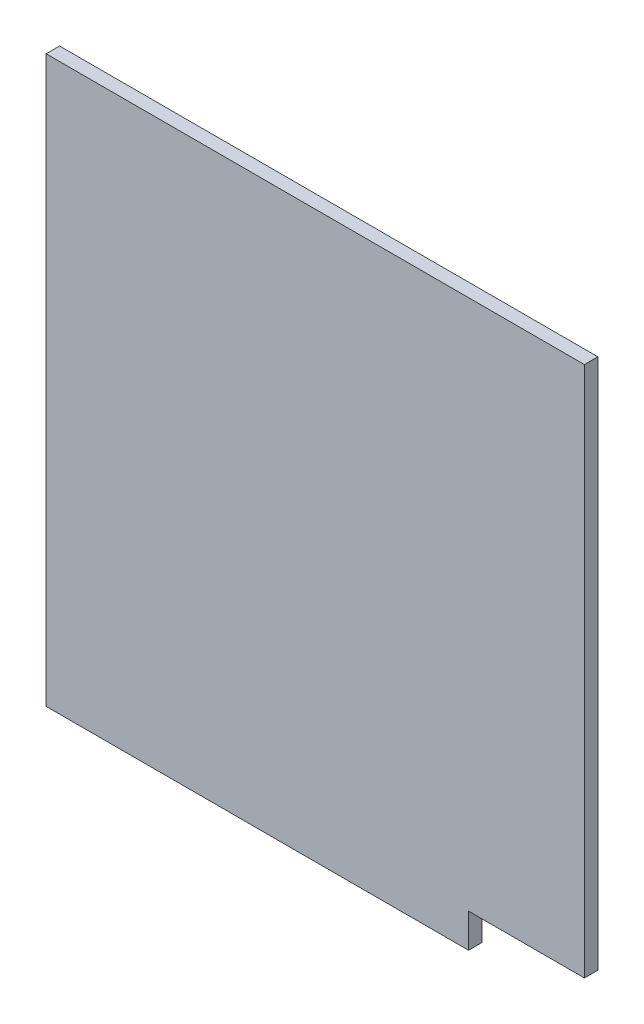
ISO-10303-21;
HEADER;
FILE_DESCRIPTION(('STEP AP214'),'2;1');
FILE_NAME('part.step','',(''),(''),'','','');
FILE_SCHEMA(('AUTOMOTIVE_DESIGN { 1 0 10303 214 1 1 1 1 }'));
ENDSEC;
DATA;
#1=APPLICATION_CONTEXT('core data for automotive mechanical design processes');
#2=APPLICATION_PROTOCOL_DEFINITION('international standard','automotive_design',2000,#1);
#3=PRODUCT_CONTEXT('',#1,'mechanical');
#4=PRODUCT('Part','Part','',(#3));
#5=PRODUCT_RELATED_PRODUCT_CATEGORY('part','',(#4));
#6=PRODUCT_DEFINITION_FORMATION('','',#4);
#7=PRODUCT_DEFINITION_CONTEXT('part definition',#1,'design');
#8=PRODUCT_DEFINITION('design','',#6,#7);
#9=PRODUCT_DEFINITION_SHAPE('','',#8);
#10=(LENGTH_UNIT() NAMED_UNIT(*) SI_UNIT(.MILLI.,.METRE.));
#11=(NAMED_UNIT(*) PLANE_ANGLE_UNIT() SI_UNIT($,.RADIAN.));
#12=(NAMED_UNIT(*) SI_UNIT($,.STERADIAN.) SOLID_ANGLE_UNIT());
#13=UNCERTAINTY_MEASURE_WITH_UNIT(LENGTH_MEASURE(1.E-05),#10,'distance_accuracy_value','');
#14=(GEOMETRIC_REPRESENTATION_CONTEXT(3) GLOBAL_UNCERTAINTY_ASSIGNED_CONTEXT((#13)) GLOBAL_UNIT_ASSIGNED_CONTEXT((#10,
#11,#12)) REPRESENTATION_CONTEXT('',''));
#15=CARTESIAN_POINT('',(0.,0.,0.));
#16=DIRECTION('',(0.,0.,1.));
#17=DIRECTION('',(1.,0.,0.));
#18=AXIS2_PLACEMENT_3D('',#15,#16,#17);
#19=CARTESIAN_POINT('',(0.,-200.,-4.7625));
#20=DIRECTION('',(0.,-1.,0.));
#21=DIRECTION('',(0.,0.,-1.));
#22=AXIS2_PLACEMENT_3D('',#19,#20,#21);
#23=PLANE('',#22);
#24=DIRECTION('',(1.,0.,0.));
#25=VECTOR('',#24,1.);
#26=CARTESIAN_POINT('',(0.,-200.,0.));
#27=LINE('',#26,#25);
#28=CARTESIAN_POINT('',(4.7625,-200.,0.));
#29=VERTEX_POINT('',#28);
#30=CARTESIAN_POINT('',(154.2375,-200.,0.));
#31=VERTEX_POINT('',#30);
#32=EDGE_CURVE('E117',#29,#31,#27,.T.);
#33=ORIENTED_EDGE('',*,*,#32,.F.);
#34=DIRECTION('',(0.,0.,1.));
#35=VECTOR('',#34,1.);
#36=CARTESIAN_POINT('',(4.7625,-200.,-4.7625));
#37=LINE('',#36,#35);
#38=CARTESIAN_POINT('',(4.7625,-200.,-4.7625));
#39=VERTEX_POINT('',#38);
#40=EDGE_CURVE('E11',#39,#29,#37,.T.);
#41=ORIENTED_EDGE('',*,*,#40,.F.);
#42=DIRECTION('',(1.,0.,0.));
#43=VECTOR('',#42,1.);
#44=CARTESIAN_POINT('',(0.,-200.,-4.7625));
#45=LINE('',#44,#43);
#46=CARTESIAN_POINT('',(154.2375,-200.,-4.7625));
#47=VERTEX_POINT('',#46);
#48=EDGE_CURVE('E131',#39,#47,#45,.T.);
#49=ORIENTED_EDGE('',*,*,#48,.T.);
#50=DIRECTION('',(0.,0.,1.));
#51=VECTOR('',#50,1.);
#52=CARTESIAN_POINT('',(154.2375,-200.,-4.7625));
#53=LINE('',#52,#51);
#54=EDGE_CURVE('E36',#47,#31,#53,.T.);
#55=ORIENTED_EDGE('',*,*,#54,.T.);
#56=EDGE_LOOP('',(#33,#41,#49,#55));
#57=FACE_BOUND('',#56,.T.);
#58=ADVANCED_FACE('F33',(#57),#23,.T.);
#59=CARTESIAN_POINT('',(4.7625,0.,-4.7625));
#60=DIRECTION('',(-1.,0.,0.));
#61=DIRECTION('',(0.,0.,1.));
#62=AXIS2_PLACEMENT_3D('',#59,#60,#61);
#63=PLANE('',#62);
#64=DIRECTION('',(0.,-1.,0.));
#65=VECTOR('',#64,1.);
#66=CARTESIAN_POINT('',(4.7625,0.,0.));
#67=LINE('',#66,#65);
#68=CARTESIAN_POINT('',(4.7625,0.,0.));
#69=VERTEX_POINT('',#68);
#70=EDGE_CURVE('E129',#69,#29,#67,.T.);
#71=ORIENTED_EDGE('',*,*,#70,.F.);
#72=DIRECTION('',(0.,0.,1.));
#73=VECTOR('',#72,1.);
#74=CARTESIAN_POINT('',(4.7625,0.,-4.7625));
#75=LINE('',#74,#73);
#76=CARTESIAN_POINT('',(4.7625,0.,-4.7625));
#77=VERTEX_POINT('',#76);
#78=EDGE_CURVE('E42',#77,#69,#75,.T.);
#79=ORIENTED_EDGE('',*,*,#78,.F.);
#80=DIRECTION('',(0.,-1.,0.));
#81=VECTOR('',#80,1.);
#82=CARTESIAN_POINT('',(4.7625,0.,-4.7625));
#83=LINE('',#82,#81);
#84=EDGE_CURVE('E97',#77,#39,#83,.T.);
#85=ORIENTED_EDGE('',*,*,#84,.T.);
#86=ORIENTED_EDGE('',*,*,#40,.T.);
#87=EDGE_LOOP('',(#71,#79,#85,#86));
#88=FACE_BOUND('',#87,.T.);
#89=ADVANCED_FACE('F140',(#88),#63,.T.);
#90=CARTESIAN_POINT('',(0.,0.,-4.7625));
#91=DIRECTION('',(0.,-1.,0.));
#92=DIRECTION('',(0.,0.,-1.));
#93=AXIS2_PLACEMENT_3D('',#90,#91,#92);
#94=PLANE('',#93);
#95=DIRECTION('',(1.,0.,0.));
#96=VECTOR('',#95,1.);
#97=CARTESIAN_POINT('',(0.,0.,0.));
#98=LINE('',#97,#96);
#99=CARTESIAN_POINT('',(195.2375,0.,0.));
#100=VERTEX_POINT('',#99);
#101=EDGE_CURVE('E102',#69,#100,#98,.T.);
#102=ORIENTED_EDGE('',*,*,#101,.T.);
#103=DIRECTION('',(0.,0.,1.));
#104=VECTOR('',#103,1.);
#105=CARTESIAN_POINT('',(195.2375,0.,-4.7625));
#106=LINE('',#105,#104);
#107=CARTESIAN_POINT('',(195.2375,0.,-4.7625));
#108=VERTEX_POINT('',#107);
#109=EDGE_CURVE('E100',#108,#100,#106,.T.);
#110=ORIENTED_EDGE('',*,*,#109,.F.);
#111=DIRECTION('',(1.,0.,0.));
#112=VECTOR('',#111,1.);
#113=CARTESIAN_POINT('',(0.,0.,-4.7625));
#114=LINE('',#113,#112);
#115=EDGE_CURVE('E91',#77,#108,#114,.T.);
#116=ORIENTED_EDGE('',*,*,#115,.F.);
#117=ORIENTED_EDGE('',*,*,#78,.T.);
#118=EDGE_LOOP('',(#102,#110,#116,#117));
#119=FACE_BOUND('',#118,.T.);
#120=ADVANCED_FACE('F101',(#119),#94,.F.);
#121=CARTESIAN_POINT('',(195.2375,0.,-4.7625));
#122=DIRECTION('',(-1.,0.,0.));
#123=DIRECTION('',(0.,0.,1.));
#124=AXIS2_PLACEMENT_3D('',#121,#122,#123);
#125=PLANE('',#124);
#126=DIRECTION('',(0.,-1.,0.));
#127=VECTOR('',#126,1.);
#128=CARTESIAN_POINT('',(195.2375,0.,0.));
#129=LINE('',#128,#127);
#130=CARTESIAN_POINT('',(195.2375,-188.,0.));
#131=VERTEX_POINT('',#130);
#132=EDGE_CURVE('E126',#100,#131,#129,.T.);
#133=ORIENTED_EDGE('',*,*,#132,.T.);
#134=DIRECTION('',(0.,0.,1.));
#135=VECTOR('',#134,1.);
#136=CARTESIAN_POINT('',(195.2375,-188.,-4.7625));
#137=LINE('',#136,#135);
#138=CARTESIAN_POINT('',(195.2375,-188.,-4.7625));
#139=VERTEX_POINT('',#138);
#140=EDGE_CURVE('E105',#139,#131,#137,.T.);
#141=ORIENTED_EDGE('',*,*,#140,.F.);
#142=DIRECTION('',(0.,-1.,0.));
#143=VECTOR('',#142,1.);
#144=CARTESIAN_POINT('',(195.2375,0.,-4.7625));
#145=LINE('',#144,#143);
#146=EDGE_CURVE('E95',#108,#139,#145,.T.);
#147=ORIENTED_EDGE('',*,*,#146,.F.);
#148=ORIENTED_EDGE('',*,*,#109,.T.);
#149=EDGE_LOOP('',(#133,#141,#147,#148));
#150=FACE_BOUND('',#149,.T.);
#151=ADVANCED_FACE('F107',(#150),#125,.F.);
#152=CARTESIAN_POINT('',(0.,-188.,-4.7625));
#153=DIRECTION('',(0.,1.,0.));
#154=DIRECTION('',(0.,0.,1.));
#155=AXIS2_PLACEMENT_3D('',#152,#153,#154);
#156=PLANE('',#155);
#157=DIRECTION('',(-1.,0.,0.));
#158=VECTOR('',#157,1.);
#159=CARTESIAN_POINT('',(0.,-188.,0.));
#160=LINE('',#159,#158);
#161=CARTESIAN_POINT('',(154.2375,-188.,0.));
#162=VERTEX_POINT('',#161);
#163=EDGE_CURVE('E123',#131,#162,#160,.T.);
#164=ORIENTED_EDGE('',*,*,#163,.T.);
#165=DIRECTION('',(0.,0.,1.));
#166=VECTOR('',#165,1.);
#167=CARTESIAN_POINT('',(154.2375,-188.,-4.7625));
#168=LINE('',#167,#166);
#169=CARTESIAN_POINT('',(154.2375,-188.,-4.7625));
#170=VERTEX_POINT('',#169);
#171=EDGE_CURVE('E134',#170,#162,#168,.T.);
#172=ORIENTED_EDGE('',*,*,#171,.F.);
#173=DIRECTION('',(-1.,0.,0.));
#174=VECTOR('',#173,1.);
#175=CARTESIAN_POINT('',(0.,-188.,-4.7625));
#176=LINE('',#175,#174);
#177=EDGE_CURVE('E110',#139,#170,#176,.T.);
#178=ORIENTED_EDGE('',*,*,#177,.F.);
#179=ORIENTED_EDGE('',*,*,#140,.T.);
#180=EDGE_LOOP('',(#164,#172,#178,#179));
#181=FACE_BOUND('',#180,.T.);
#182=ADVANCED_FACE('F153',(#181),#156,.F.);
#183=CARTESIAN_POINT('',(154.2375,0.,-4.7625));
#184=DIRECTION('',(1.,0.,0.));
#185=DIRECTION('',(0.,0.,-1.));
#186=AXIS2_PLACEMENT_3D('',#183,#184,#185);
#187=PLANE('',#186);
#188=DIRECTION('',(0.,1.,0.));
#189=VECTOR('',#188,1.);
#190=CARTESIAN_POINT('',(154.2375,0.,0.));
#191=LINE('',#190,#189);
#192=EDGE_CURVE('E120',#31,#162,#191,.T.);
#193=ORIENTED_EDGE('',*,*,#192,.F.);
#194=ORIENTED_EDGE('',*,*,#54,.F.);
#195=DIRECTION('',(0.,1.,0.));
#196=VECTOR('',#195,1.);
#197=CARTESIAN_POINT('',(154.2375,0.,-4.7625));
#198=LINE('',#197,#196);
#199=EDGE_CURVE('E112',#47,#170,#198,.T.);
#200=ORIENTED_EDGE('',*,*,#199,.T.);
#201=ORIENTED_EDGE('',*,*,#171,.T.);
#202=EDGE_LOOP('',(#193,#194,#200,#201));
#203=FACE_BOUND('',#202,.T.);
#204=ADVANCED_FACE('F136',(#203),#187,.T.);
#205=CARTESIAN_POINT('',(0.,0.,-4.7625));
#206=DIRECTION('',(0.,0.,1.));
#207=DIRECTION('',(1.,0.,0.));
#208=AXIS2_PLACEMENT_3D('',#205,#206,#207);
#209=PLANE('',#208);
#210=ORIENTED_EDGE('',*,*,#48,.F.);
#211=ORIENTED_EDGE('',*,*,#84,.F.);
#212=ORIENTED_EDGE('',*,*,#115,.T.);
#213=ORIENTED_EDGE('',*,*,#146,.T.);
#214=ORIENTED_EDGE('',*,*,#177,.T.);
#215=ORIENTED_EDGE('',*,*,#199,.F.);
#216=EDGE_LOOP('',(#210,#211,#212,#213,#214,#215));
#217=FACE_BOUND('',#216,.T.);
#218=ADVANCED_FACE('F93',(#217),#209,.F.);
#219=CARTESIAN_POINT('',(0.,0.,0.));
#220=DIRECTION('',(0.,0.,1.));
#221=DIRECTION('',(1.,0.,0.));
#222=AXIS2_PLACEMENT_3D('',#219,#220,#221);
#223=PLANE('',#222);
#224=ORIENTED_EDGE('',*,*,#32,.T.);
#225=ORIENTED_EDGE('',*,*,#192,.T.);
#226=ORIENTED_EDGE('',*,*,#163,.F.);
#227=ORIENTED_EDGE('',*,*,#132,.F.);
#228=ORIENTED_EDGE('',*,*,#101,.F.);
#229=ORIENTED_EDGE('',*,*,#70,.T.);
#230=EDGE_LOOP('',(#224,#225,#226,#227,#228,#229));
#231=FACE_BOUND('',#230,.T.);
#232=ADVANCED_FACE('F139',(#231),#223,.T.);
#233=CLOSED_SHELL('',(#58,#89,#120,#151,#182,#204,#218,#232));
#234=MANIFOLD_SOLID_BREP('B2',#233);
#235=ADVANCED_BREP_SHAPE_REPRESENTATION('',(#18,#234),#14);
#236=SHAPE_DEFINITION_REPRESENTATION(#9,#235);
ENDSEC;
END-ISO-10303-21;
